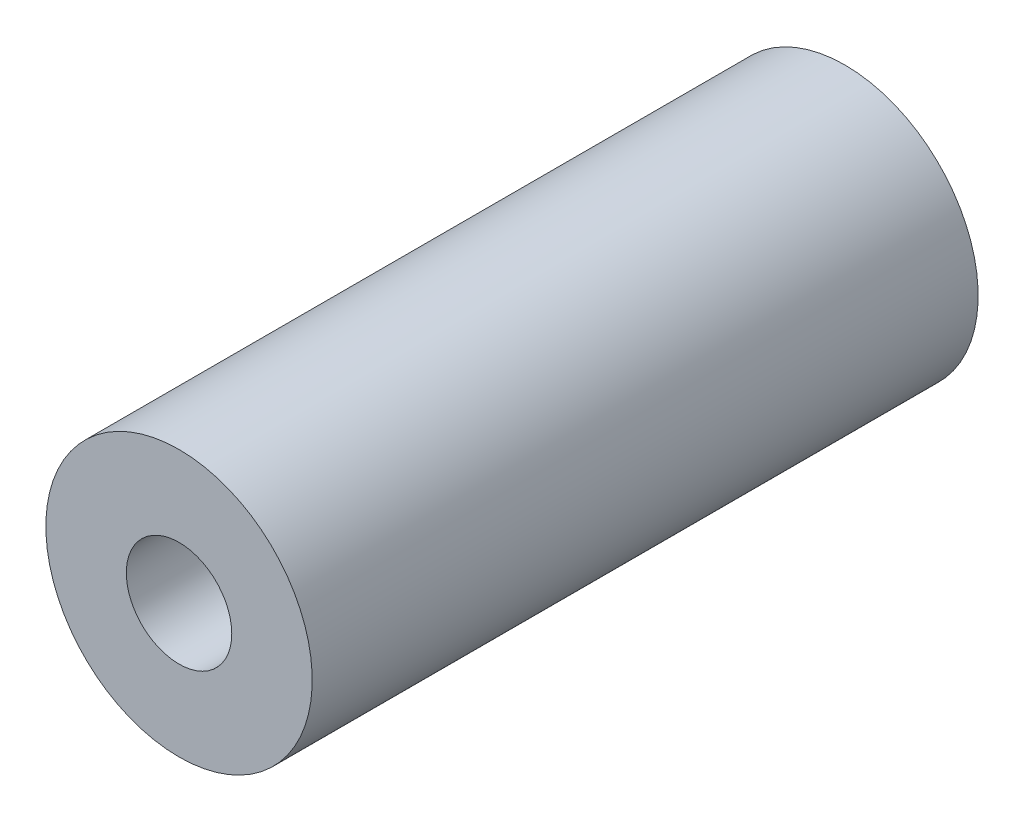
ISO-10303-21;
HEADER;
FILE_DESCRIPTION(('STEP AP214'),'2;1');
FILE_NAME('part.step','',(''),(''),'','','');
FILE_SCHEMA(('AUTOMOTIVE_DESIGN { 1 0 10303 214 1 1 1 1 }'));
ENDSEC;
DATA;
#1=APPLICATION_CONTEXT('core data for automotive mechanical design processes');
#2=APPLICATION_PROTOCOL_DEFINITION('international standard','automotive_design',2000,#1);
#3=PRODUCT_CONTEXT('',#1,'mechanical');
#4=PRODUCT('Part','Part','',(#3));
#5=PRODUCT_RELATED_PRODUCT_CATEGORY('part','',(#4));
#6=PRODUCT_DEFINITION_FORMATION('','',#4);
#7=PRODUCT_DEFINITION_CONTEXT('part definition',#1,'design');
#8=PRODUCT_DEFINITION('design','',#6,#7);
#9=PRODUCT_DEFINITION_SHAPE('','',#8);
#10=(LENGTH_UNIT() NAMED_UNIT(*) SI_UNIT(.MILLI.,.METRE.));
#11=(NAMED_UNIT(*) PLANE_ANGLE_UNIT() SI_UNIT($,.RADIAN.));
#12=(NAMED_UNIT(*) SI_UNIT($,.STERADIAN.) SOLID_ANGLE_UNIT());
#13=UNCERTAINTY_MEASURE_WITH_UNIT(LENGTH_MEASURE(1.E-05),#10,'distance_accuracy_value','');
#14=(GEOMETRIC_REPRESENTATION_CONTEXT(3) GLOBAL_UNCERTAINTY_ASSIGNED_CONTEXT((#13)) GLOBAL_UNIT_ASSIGNED_CONTEXT((#10,
#11,#12)) REPRESENTATION_CONTEXT('',''));
#15=CARTESIAN_POINT('',(0.,0.,0.));
#16=DIRECTION('',(0.,0.,1.));
#17=DIRECTION('',(1.,0.,0.));
#18=AXIS2_PLACEMENT_3D('',#15,#16,#17);
#19=CARTESIAN_POINT('',(0.,0.,0.));
#20=DIRECTION('',(0.,0.,-1.));
#21=DIRECTION('',(0.,1.,0.));
#22=AXIS2_PLACEMENT_3D('',#19,#20,#21);
#23=PLANE('',#22);
#24=CARTESIAN_POINT('',(0.,0.,0.));
#25=DIRECTION('',(0.,0.,1.));
#26=DIRECTION('',(1.,0.,0.));
#27=AXIS2_PLACEMENT_3D('',#24,#25,#26);
#28=CIRCLE('',#27,2.375);
#29=CARTESIAN_POINT('',(2.375,0.,0.));
#30=VERTEX_POINT('',#29);
#31=EDGE_CURVE('E122',#30,#30,#28,.T.);
#32=ORIENTED_EDGE('',*,*,#31,.F.);
#33=EDGE_LOOP('',(#32));
#34=FACE_BOUND('',#33,.T.);
#35=CARTESIAN_POINT('',(0.,0.,0.));
#36=DIRECTION('',(0.,0.,-1.));
#37=DIRECTION('',(0.,1.,0.));
#38=AXIS2_PLACEMENT_3D('',#35,#36,#37);
#39=CIRCLE('',#38,6.);
#40=CARTESIAN_POINT('',(0.,6.,0.));
#41=VERTEX_POINT('',#40);
#42=EDGE_CURVE('E11',#41,#41,#39,.T.);
#43=ORIENTED_EDGE('',*,*,#42,.F.);
#44=EDGE_LOOP('',(#43));
#45=FACE_BOUND('',#44,.T.);
#46=ADVANCED_FACE('F39',(#34,#45),#23,.F.);
#47=CARTESIAN_POINT('',(0.,0.,-30.));
#48=DIRECTION('',(0.,0.,-1.));
#49=DIRECTION('',(0.,1.,0.));
#50=AXIS2_PLACEMENT_3D('',#47,#48,#49);
#51=CYLINDRICAL_SURFACE('',#50,6.);
#52=CARTESIAN_POINT('',(0.,0.,-30.));
#53=DIRECTION('',(0.,0.,-1.));
#54=DIRECTION('',(0.,1.,0.));
#55=AXIS2_PLACEMENT_3D('',#52,#53,#54);
#56=CIRCLE('',#55,6.);
#57=CARTESIAN_POINT('',(0.,6.00000000000001,-30.));
#58=VERTEX_POINT('',#57);
#59=EDGE_CURVE('E47',#58,#58,#56,.T.);
#60=ORIENTED_EDGE('',*,*,#59,.F.);
#61=EDGE_LOOP('',(#60));
#62=FACE_BOUND('',#61,.T.);
#63=ORIENTED_EDGE('',*,*,#42,.T.);
#64=EDGE_LOOP('',(#63));
#65=FACE_BOUND('',#64,.T.);
#66=ADVANCED_FACE('F141',(#62,#65),#51,.T.);
#67=CARTESIAN_POINT('',(0.,-5.99999999999999,-30.));
#68=DIRECTION('',(0.,0.,1.));
#69=DIRECTION('',(0.,-1.,0.));
#70=AXIS2_PLACEMENT_3D('',#67,#68,#69);
#71=PLANE('',#70);
#72=CARTESIAN_POINT('',(0.,0.,-30.));
#73=DIRECTION('',(0.,0.,-1.));
#74=DIRECTION('',(0.,1.,0.));
#75=AXIS2_PLACEMENT_3D('',#72,#73,#74);
#76=CIRCLE('',#75,4.5);
#77=CARTESIAN_POINT('',(0.,4.5,-30.));
#78=VERTEX_POINT('',#77);
#79=EDGE_CURVE('E105',#78,#78,#76,.T.);
#80=ORIENTED_EDGE('',*,*,#79,.F.);
#81=EDGE_LOOP('',(#80));
#82=FACE_BOUND('',#81,.T.);
#83=ORIENTED_EDGE('',*,*,#59,.T.);
#84=EDGE_LOOP('',(#83));
#85=FACE_BOUND('',#84,.T.);
#86=ADVANCED_FACE('F139',(#82,#85),#71,.F.);
#87=CARTESIAN_POINT('',(0.,0.,-7.5));
#88=DIRECTION('',(0.,0.,1.));
#89=DIRECTION('',(1.,0.,0.));
#90=AXIS2_PLACEMENT_3D('',#87,#88,#89);
#91=CYLINDRICAL_SURFACE('',#90,2.375);
#92=ORIENTED_EDGE('',*,*,#31,.T.);
#93=EDGE_LOOP('',(#92));
#94=FACE_BOUND('',#93,.T.);
#95=DIRECTION('',(0.,0.,1.));
#96=VECTOR('',#95,1.);
#97=CARTESIAN_POINT('',(-1.84136498283203,1.5,-15.));
#98=LINE('',#97,#96);
#99=CARTESIAN_POINT('',(-1.84136498283203,1.5,-15.));
#100=VERTEX_POINT('',#99);
#101=CARTESIAN_POINT('',(-1.84136498283203,1.5,-7.5));
#102=VERTEX_POINT('',#101);
#103=EDGE_CURVE('E119',#100,#102,#98,.T.);
#104=ORIENTED_EDGE('',*,*,#103,.T.);
#105=CARTESIAN_POINT('',(0.,0.,-7.5));
#106=DIRECTION('',(0.,0.,1.));
#107=DIRECTION('',(1.,0.,0.));
#108=AXIS2_PLACEMENT_3D('',#105,#106,#107);
#109=CIRCLE('',#108,2.375);
#110=CARTESIAN_POINT('',(1.84136498283203,1.5,-7.5));
#111=VERTEX_POINT('',#110);
#112=EDGE_CURVE('E129',#111,#102,#109,.T.);
#113=ORIENTED_EDGE('',*,*,#112,.F.);
#114=DIRECTION('',(0.,0.,1.));
#115=VECTOR('',#114,1.);
#116=CARTESIAN_POINT('',(1.84136498283203,1.5,-15.));
#117=LINE('',#116,#115);
#118=CARTESIAN_POINT('',(1.84136498283203,1.5,-15.));
#119=VERTEX_POINT('',#118);
#120=EDGE_CURVE('E62',#119,#111,#117,.T.);
#121=ORIENTED_EDGE('',*,*,#120,.F.);
#122=CARTESIAN_POINT('',(0.,0.,-15.));
#123=DIRECTION('',(0.,0.,1.));
#124=DIRECTION('',(1.,0.,0.));
#125=AXIS2_PLACEMENT_3D('',#122,#123,#124);
#126=CIRCLE('',#125,2.375);
#127=EDGE_CURVE('E116',#100,#119,#126,.T.);
#128=ORIENTED_EDGE('',*,*,#127,.F.);
#129=EDGE_LOOP('',(#104,#113,#121,#128));
#130=FACE_BOUND('',#129,.T.);
#131=ADVANCED_FACE('F152',(#94,#130),#91,.F.);
#132=CARTESIAN_POINT('',(0.,0.,-7.5));
#133=DIRECTION('',(0.,0.,1.));
#134=DIRECTION('',(1.,0.,0.));
#135=AXIS2_PLACEMENT_3D('',#132,#133,#134);
#136=PLANE('',#135);
#137=DIRECTION('',(1.,0.,0.));
#138=VECTOR('',#137,1.);
#139=CARTESIAN_POINT('',(0.,1.5,-7.5));
#140=LINE('',#139,#138);
#141=EDGE_CURVE('E126',#102,#111,#140,.T.);
#142=ORIENTED_EDGE('',*,*,#141,.T.);
#143=ORIENTED_EDGE('',*,*,#112,.T.);
#144=EDGE_LOOP('',(#142,#143));
#145=FACE_BOUND('',#144,.T.);
#146=ADVANCED_FACE('F155',(#145),#136,.T.);
#147=CARTESIAN_POINT('',(0.,1.5,-15.));
#148=DIRECTION('',(0.,1.,0.));
#149=DIRECTION('',(-1.,0.,0.));
#150=AXIS2_PLACEMENT_3D('',#147,#148,#149);
#151=PLANE('',#150);
#152=ORIENTED_EDGE('',*,*,#141,.F.);
#153=ORIENTED_EDGE('',*,*,#103,.F.);
#154=DIRECTION('',(-1.,0.,0.));
#155=VECTOR('',#154,1.);
#156=CARTESIAN_POINT('',(0.,1.5,-15.));
#157=LINE('',#156,#155);
#158=EDGE_CURVE('E110',#119,#100,#157,.T.);
#159=ORIENTED_EDGE('',*,*,#158,.F.);
#160=ORIENTED_EDGE('',*,*,#120,.T.);
#161=EDGE_LOOP('',(#152,#153,#159,#160));
#162=FACE_BOUND('',#161,.T.);
#163=ADVANCED_FACE('F161',(#162),#151,.F.);
#164=CARTESIAN_POINT('',(0.,0.,-20.));
#165=DIRECTION('',(0.,0.,-1.));
#166=DIRECTION('',(0.,1.,0.));
#167=AXIS2_PLACEMENT_3D('',#164,#165,#166);
#168=CYLINDRICAL_SURFACE('',#167,4.5);
#169=CARTESIAN_POINT('',(0.,0.,-20.));
#170=DIRECTION('',(0.,0.,-1.));
#171=DIRECTION('',(0.,1.,0.));
#172=AXIS2_PLACEMENT_3D('',#169,#170,#171);
#173=CIRCLE('',#172,4.5);
#174=CARTESIAN_POINT('',(-3.74165738677394,2.5,-20.));
#175=VERTEX_POINT('',#174);
#176=CARTESIAN_POINT('',(3.74165738677394,2.5,-20.));
#177=VERTEX_POINT('',#176);
#178=EDGE_CURVE('E107',#175,#177,#173,.T.);
#179=ORIENTED_EDGE('',*,*,#178,.F.);
#180=DIRECTION('',(0.,0.,-1.));
#181=VECTOR('',#180,1.);
#182=CARTESIAN_POINT('',(-3.74165738677394,2.5,-15.));
#183=LINE('',#182,#181);
#184=CARTESIAN_POINT('',(-3.74165738677394,2.5,-15.));
#185=VERTEX_POINT('',#184);
#186=EDGE_CURVE('E54',#185,#175,#183,.T.);
#187=ORIENTED_EDGE('',*,*,#186,.F.);
#188=CARTESIAN_POINT('',(0.,0.,-15.));
#189=DIRECTION('',(0.,0.,-1.));
#190=DIRECTION('',(0.,1.,0.));
#191=AXIS2_PLACEMENT_3D('',#188,#189,#190);
#192=CIRCLE('',#191,4.5);
#193=CARTESIAN_POINT('',(3.74165738677394,2.5,-15.));
#194=VERTEX_POINT('',#193);
#195=EDGE_CURVE('E89',#194,#185,#192,.T.);
#196=ORIENTED_EDGE('',*,*,#195,.F.);
#197=DIRECTION('',(0.,0.,-1.));
#198=VECTOR('',#197,1.);
#199=CARTESIAN_POINT('',(3.74165738677394,2.5,-15.));
#200=LINE('',#199,#198);
#201=EDGE_CURVE('E79',#194,#177,#200,.T.);
#202=ORIENTED_EDGE('',*,*,#201,.T.);
#203=EDGE_LOOP('',(#179,#187,#196,#202));
#204=FACE_BOUND('',#203,.T.);
#205=ORIENTED_EDGE('',*,*,#79,.T.);
#206=EDGE_LOOP('',(#205));
#207=FACE_BOUND('',#206,.T.);
#208=ADVANCED_FACE('F92',(#204,#207),#168,.F.);
#209=CARTESIAN_POINT('',(0.,0.,-20.));
#210=DIRECTION('',(0.,0.,-1.));
#211=DIRECTION('',(0.,1.,0.));
#212=AXIS2_PLACEMENT_3D('',#209,#210,#211);
#213=PLANE('',#212);
#214=DIRECTION('',(1.,0.,0.));
#215=VECTOR('',#214,1.);
#216=CARTESIAN_POINT('',(0.,2.5,-20.));
#217=LINE('',#216,#215);
#218=EDGE_CURVE('E84',#175,#177,#217,.T.);
#219=ORIENTED_EDGE('',*,*,#218,.F.);
#220=ORIENTED_EDGE('',*,*,#178,.T.);
#221=EDGE_LOOP('',(#219,#220));
#222=FACE_BOUND('',#221,.T.);
#223=ADVANCED_FACE('F168',(#222),#213,.T.);
#224=CARTESIAN_POINT('',(0.,0.,-15.));
#225=DIRECTION('',(0.,0.,-1.));
#226=DIRECTION('',(0.,1.,0.));
#227=AXIS2_PLACEMENT_3D('',#224,#225,#226);
#228=PLANE('',#227);
#229=DIRECTION('',(1.,0.,0.));
#230=VECTOR('',#229,1.);
#231=CARTESIAN_POINT('',(0.,2.5,-15.));
#232=LINE('',#231,#230);
#233=EDGE_CURVE('E83',#185,#194,#232,.T.);
#234=ORIENTED_EDGE('',*,*,#233,.T.);
#235=ORIENTED_EDGE('',*,*,#195,.T.);
#236=EDGE_LOOP('',(#234,#235));
#237=FACE_BOUND('',#236,.T.);
#238=ORIENTED_EDGE('',*,*,#158,.T.);
#239=ORIENTED_EDGE('',*,*,#127,.T.);
#240=EDGE_LOOP('',(#238,#239));
#241=FACE_BOUND('',#240,.T.);
#242=ADVANCED_FACE('F97',(#237,#241),#228,.T.);
#243=CARTESIAN_POINT('',(0.,2.5,-15.));
#244=DIRECTION('',(0.,1.,0.));
#245=DIRECTION('',(0.,0.,1.));
#246=AXIS2_PLACEMENT_3D('',#243,#244,#245);
#247=PLANE('',#246);
#248=ORIENTED_EDGE('',*,*,#218,.T.);
#249=ORIENTED_EDGE('',*,*,#201,.F.);
#250=ORIENTED_EDGE('',*,*,#233,.F.);
#251=ORIENTED_EDGE('',*,*,#186,.T.);
#252=EDGE_LOOP('',(#248,#249,#250,#251));
#253=FACE_BOUND('',#252,.T.);
#254=ADVANCED_FACE('F81',(#253),#247,.F.);
#255=CLOSED_SHELL('',(#46,#66,#86,#131,#146,#163,#208,#223,#242,#254));
#256=MANIFOLD_SOLID_BREP('B2',#255);
#257=ADVANCED_BREP_SHAPE_REPRESENTATION('',(#18,#256),#14);
#258=SHAPE_DEFINITION_REPRESENTATION(#9,#257);
ENDSEC;
END-ISO-10303-21;
